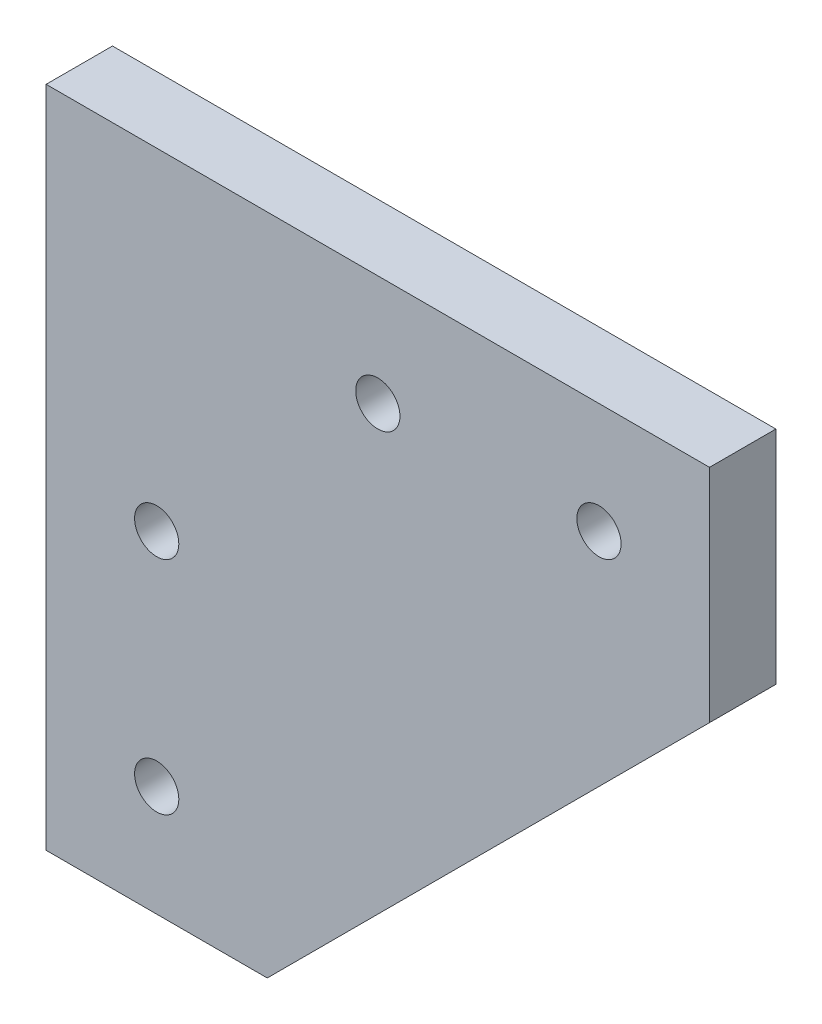
ISO-10303-21;
HEADER;
FILE_DESCRIPTION(('STEP AP214'),'2;1');
FILE_NAME('part.step','',(''),(''),'','','');
FILE_SCHEMA(('AUTOMOTIVE_DESIGN { 1 0 10303 214 1 1 1 1 }'));
ENDSEC;
DATA;
#1=APPLICATION_CONTEXT('core data for automotive mechanical design processes');
#2=APPLICATION_PROTOCOL_DEFINITION('international standard','automotive_design',2000,#1);
#3=PRODUCT_CONTEXT('',#1,'mechanical');
#4=PRODUCT('Part','Part','',(#3));
#5=PRODUCT_RELATED_PRODUCT_CATEGORY('part','',(#4));
#6=PRODUCT_DEFINITION_FORMATION('','',#4);
#7=PRODUCT_DEFINITION_CONTEXT('part definition',#1,'design');
#8=PRODUCT_DEFINITION('design','',#6,#7);
#9=PRODUCT_DEFINITION_SHAPE('','',#8);
#10=(LENGTH_UNIT() NAMED_UNIT(*) SI_UNIT(.MILLI.,.METRE.));
#11=(NAMED_UNIT(*) PLANE_ANGLE_UNIT() SI_UNIT($,.RADIAN.));
#12=(NAMED_UNIT(*) SI_UNIT($,.STERADIAN.) SOLID_ANGLE_UNIT());
#13=UNCERTAINTY_MEASURE_WITH_UNIT(LENGTH_MEASURE(1.E-05),#10,'distance_accuracy_value','');
#14=(GEOMETRIC_REPRESENTATION_CONTEXT(3) GLOBAL_UNCERTAINTY_ASSIGNED_CONTEXT((#13)) GLOBAL_UNIT_ASSIGNED_CONTEXT((#10,
#11,#12)) REPRESENTATION_CONTEXT('',''));
#15=CARTESIAN_POINT('',(0.,0.,0.));
#16=DIRECTION('',(0.,0.,1.));
#17=DIRECTION('',(1.,0.,0.));
#18=AXIS2_PLACEMENT_3D('',#15,#16,#17);
#19=CARTESIAN_POINT('',(0.,0.,6.));
#20=DIRECTION('',(0.,0.,1.));
#21=DIRECTION('',(1.,0.,0.));
#22=AXIS2_PLACEMENT_3D('',#19,#20,#21);
#23=PLANE('',#22);
#24=CARTESIAN_POINT('',(10.,-50.,6.));
#25=DIRECTION('',(0.,0.,1.));
#26=DIRECTION('',(1.,0.,0.));
#27=AXIS2_PLACEMENT_3D('',#24,#25,#26);
#28=CIRCLE('',#27,2.);
#29=CARTESIAN_POINT('',(12.,-50.,6.));
#30=VERTEX_POINT('',#29);
#31=EDGE_CURVE('E172',#30,#30,#28,.T.);
#32=ORIENTED_EDGE('',*,*,#31,.F.);
#33=EDGE_LOOP('',(#32));
#34=FACE_BOUND('',#33,.T.);
#35=CARTESIAN_POINT('',(50.,-10.,6.));
#36=DIRECTION('',(0.,0.,1.));
#37=DIRECTION('',(1.,0.,0.));
#38=AXIS2_PLACEMENT_3D('',#35,#36,#37);
#39=CIRCLE('',#38,2.);
#40=CARTESIAN_POINT('',(52.,-10.,6.));
#41=VERTEX_POINT('',#40);
#42=EDGE_CURVE('E112',#41,#41,#39,.T.);
#43=ORIENTED_EDGE('',*,*,#42,.F.);
#44=EDGE_LOOP('',(#43));
#45=FACE_BOUND('',#44,.T.);
#46=DIRECTION('',(0.,-1.,0.));
#47=VECTOR('',#46,1.);
#48=CARTESIAN_POINT('',(0.,0.,6.));
#49=LINE('',#48,#47);
#50=CARTESIAN_POINT('',(0.,0.,6.));
#51=VERTEX_POINT('',#50);
#52=CARTESIAN_POINT('',(0.,-60.,6.));
#53=VERTEX_POINT('',#52);
#54=EDGE_CURVE('E117',#51,#53,#49,.T.);
#55=ORIENTED_EDGE('',*,*,#54,.T.);
#56=DIRECTION('',(1.,0.,0.));
#57=VECTOR('',#56,1.);
#58=CARTESIAN_POINT('',(0.,-60.,6.));
#59=LINE('',#58,#57);
#60=CARTESIAN_POINT('',(20.,-60.,6.));
#61=VERTEX_POINT('',#60);
#62=EDGE_CURVE('E84',#53,#61,#59,.T.);
#63=ORIENTED_EDGE('',*,*,#62,.T.);
#64=DIRECTION('',(0.707106781186548,0.707106781186548,0.));
#65=VECTOR('',#64,1.);
#66=CARTESIAN_POINT('',(20.,-60.,6.));
#67=LINE('',#66,#65);
#68=CARTESIAN_POINT('',(60.,-20.,6.));
#69=VERTEX_POINT('',#68);
#70=EDGE_CURVE('E88',#61,#69,#67,.T.);
#71=ORIENTED_EDGE('',*,*,#70,.T.);
#72=DIRECTION('',(0.,1.,0.));
#73=VECTOR('',#72,1.);
#74=CARTESIAN_POINT('',(60.,0.,6.));
#75=LINE('',#74,#73);
#76=CARTESIAN_POINT('',(60.,0.,6.));
#77=VERTEX_POINT('',#76);
#78=EDGE_CURVE('E92',#69,#77,#75,.T.);
#79=ORIENTED_EDGE('',*,*,#78,.T.);
#80=DIRECTION('',(-1.,0.,0.));
#81=VECTOR('',#80,1.);
#82=CARTESIAN_POINT('',(0.,0.,6.));
#83=LINE('',#82,#81);
#84=EDGE_CURVE('E50',#77,#51,#83,.T.);
#85=ORIENTED_EDGE('',*,*,#84,.T.);
#86=EDGE_LOOP('',(#55,#63,#71,#79,#85));
#87=FACE_BOUND('',#86,.T.);
#88=CARTESIAN_POINT('',(30.,-10.,6.));
#89=DIRECTION('',(0.,0.,1.));
#90=DIRECTION('',(1.,0.,0.));
#91=AXIS2_PLACEMENT_3D('',#88,#89,#90);
#92=CIRCLE('',#91,2.);
#93=CARTESIAN_POINT('',(32.,-10.,6.));
#94=VERTEX_POINT('',#93);
#95=EDGE_CURVE('E178',#94,#94,#92,.T.);
#96=ORIENTED_EDGE('',*,*,#95,.F.);
#97=EDGE_LOOP('',(#96));
#98=FACE_BOUND('',#97,.T.);
#99=CARTESIAN_POINT('',(10.,-30.,6.));
#100=DIRECTION('',(0.,0.,1.));
#101=DIRECTION('',(1.,0.,0.));
#102=AXIS2_PLACEMENT_3D('',#99,#100,#101);
#103=CIRCLE('',#102,2.);
#104=CARTESIAN_POINT('',(12.,-30.,6.));
#105=VERTEX_POINT('',#104);
#106=EDGE_CURVE('E163',#105,#105,#103,.T.);
#107=ORIENTED_EDGE('',*,*,#106,.F.);
#108=EDGE_LOOP('',(#107));
#109=FACE_BOUND('',#108,.T.);
#110=ADVANCED_FACE('F33',(#34,#45,#87,#98,#109),#23,.T.);
#111=CARTESIAN_POINT('',(0.,0.,0.));
#112=DIRECTION('',(0.,0.,1.));
#113=DIRECTION('',(1.,0.,0.));
#114=AXIS2_PLACEMENT_3D('',#111,#112,#113);
#115=PLANE('',#114);
#116=DIRECTION('',(0.,-1.,0.));
#117=VECTOR('',#116,1.);
#118=CARTESIAN_POINT('',(0.,0.,0.));
#119=LINE('',#118,#117);
#120=CARTESIAN_POINT('',(0.,0.,0.));
#121=VERTEX_POINT('',#120);
#122=CARTESIAN_POINT('',(0.,-60.,0.));
#123=VERTEX_POINT('',#122);
#124=EDGE_CURVE('E108',#121,#123,#119,.T.);
#125=ORIENTED_EDGE('',*,*,#124,.F.);
#126=DIRECTION('',(-1.,0.,0.));
#127=VECTOR('',#126,1.);
#128=CARTESIAN_POINT('',(0.,0.,0.));
#129=LINE('',#128,#127);
#130=CARTESIAN_POINT('',(60.,0.,0.));
#131=VERTEX_POINT('',#130);
#132=EDGE_CURVE('E76',#131,#121,#129,.T.);
#133=ORIENTED_EDGE('',*,*,#132,.F.);
#134=DIRECTION('',(0.,1.,0.));
#135=VECTOR('',#134,1.);
#136=CARTESIAN_POINT('',(60.,0.,0.));
#137=LINE('',#136,#135);
#138=CARTESIAN_POINT('',(60.,-20.,0.));
#139=VERTEX_POINT('',#138);
#140=EDGE_CURVE('E70',#139,#131,#137,.T.);
#141=ORIENTED_EDGE('',*,*,#140,.F.);
#142=DIRECTION('',(0.707106781186548,0.707106781186548,0.));
#143=VECTOR('',#142,1.);
#144=CARTESIAN_POINT('',(20.,-60.,0.));
#145=LINE('',#144,#143);
#146=CARTESIAN_POINT('',(20.,-60.,0.));
#147=VERTEX_POINT('',#146);
#148=EDGE_CURVE('E99',#147,#139,#145,.T.);
#149=ORIENTED_EDGE('',*,*,#148,.F.);
#150=DIRECTION('',(1.,0.,0.));
#151=VECTOR('',#150,1.);
#152=CARTESIAN_POINT('',(0.,-60.,0.));
#153=LINE('',#152,#151);
#154=EDGE_CURVE('E111',#123,#147,#153,.T.);
#155=ORIENTED_EDGE('',*,*,#154,.F.);
#156=EDGE_LOOP('',(#125,#133,#141,#149,#155));
#157=FACE_BOUND('',#156,.T.);
#158=CARTESIAN_POINT('',(50.,-10.,0.));
#159=DIRECTION('',(0.,0.,1.));
#160=DIRECTION('',(1.,0.,0.));
#161=AXIS2_PLACEMENT_3D('',#158,#159,#160);
#162=CIRCLE('',#161,2.);
#163=CARTESIAN_POINT('',(52.,-10.,0.));
#164=VERTEX_POINT('',#163);
#165=EDGE_CURVE('E181',#164,#164,#162,.T.);
#166=ORIENTED_EDGE('',*,*,#165,.T.);
#167=EDGE_LOOP('',(#166));
#168=FACE_BOUND('',#167,.T.);
#169=CARTESIAN_POINT('',(30.,-10.,0.));
#170=DIRECTION('',(0.,0.,1.));
#171=DIRECTION('',(1.,0.,0.));
#172=AXIS2_PLACEMENT_3D('',#169,#170,#171);
#173=CIRCLE('',#172,2.);
#174=CARTESIAN_POINT('',(32.,-10.,0.));
#175=VERTEX_POINT('',#174);
#176=EDGE_CURVE('E175',#175,#175,#173,.T.);
#177=ORIENTED_EDGE('',*,*,#176,.T.);
#178=EDGE_LOOP('',(#177));
#179=FACE_BOUND('',#178,.T.);
#180=CARTESIAN_POINT('',(10.,-50.,0.));
#181=DIRECTION('',(0.,0.,1.));
#182=DIRECTION('',(1.,0.,0.));
#183=AXIS2_PLACEMENT_3D('',#180,#181,#182);
#184=CIRCLE('',#183,2.);
#185=CARTESIAN_POINT('',(12.,-50.,0.));
#186=VERTEX_POINT('',#185);
#187=EDGE_CURVE('E169',#186,#186,#184,.T.);
#188=ORIENTED_EDGE('',*,*,#187,.T.);
#189=EDGE_LOOP('',(#188));
#190=FACE_BOUND('',#189,.T.);
#191=CARTESIAN_POINT('',(10.,-30.,0.));
#192=DIRECTION('',(0.,0.,1.));
#193=DIRECTION('',(1.,0.,0.));
#194=AXIS2_PLACEMENT_3D('',#191,#192,#193);
#195=CIRCLE('',#194,2.);
#196=CARTESIAN_POINT('',(12.,-30.,0.));
#197=VERTEX_POINT('',#196);
#198=EDGE_CURVE('E166',#197,#197,#195,.T.);
#199=ORIENTED_EDGE('',*,*,#198,.T.);
#200=EDGE_LOOP('',(#199));
#201=FACE_BOUND('',#200,.T.);
#202=ADVANCED_FACE('F121',(#157,#168,#179,#190,#201),#115,.F.);
#203=CARTESIAN_POINT('',(0.,0.,6.));
#204=DIRECTION('',(1.,0.,0.));
#205=DIRECTION('',(0.,1.,0.));
#206=AXIS2_PLACEMENT_3D('',#203,#204,#205);
#207=PLANE('',#206);
#208=ORIENTED_EDGE('',*,*,#124,.T.);
#209=DIRECTION('',(0.,0.,-1.));
#210=VECTOR('',#209,1.);
#211=CARTESIAN_POINT('',(0.,-60.,6.));
#212=LINE('',#211,#210);
#213=EDGE_CURVE('E11',#53,#123,#212,.T.);
#214=ORIENTED_EDGE('',*,*,#213,.F.);
#215=ORIENTED_EDGE('',*,*,#54,.F.);
#216=DIRECTION('',(0.,0.,-1.));
#217=VECTOR('',#216,1.);
#218=CARTESIAN_POINT('',(0.,0.,6.));
#219=LINE('',#218,#217);
#220=EDGE_CURVE('E104',#51,#121,#219,.T.);
#221=ORIENTED_EDGE('',*,*,#220,.T.);
#222=EDGE_LOOP('',(#208,#214,#215,#221));
#223=FACE_BOUND('',#222,.T.);
#224=ADVANCED_FACE('F35',(#223),#207,.F.);
#225=CARTESIAN_POINT('',(0.,-60.,6.));
#226=DIRECTION('',(0.,1.,0.));
#227=DIRECTION('',(0.,0.,1.));
#228=AXIS2_PLACEMENT_3D('',#225,#226,#227);
#229=PLANE('',#228);
#230=ORIENTED_EDGE('',*,*,#154,.T.);
#231=DIRECTION('',(0.,0.,-1.));
#232=VECTOR('',#231,1.);
#233=CARTESIAN_POINT('',(20.,-60.,6.));
#234=LINE('',#233,#232);
#235=EDGE_CURVE('E42',#61,#147,#234,.T.);
#236=ORIENTED_EDGE('',*,*,#235,.F.);
#237=ORIENTED_EDGE('',*,*,#62,.F.);
#238=ORIENTED_EDGE('',*,*,#213,.T.);
#239=EDGE_LOOP('',(#230,#236,#237,#238));
#240=FACE_BOUND('',#239,.T.);
#241=ADVANCED_FACE('F230',(#240),#229,.F.);
#242=CARTESIAN_POINT('',(20.,-60.,6.));
#243=DIRECTION('',(-0.707106781186547,0.707106781186547,0.));
#244=DIRECTION('',(-0.707106781186548,-0.707106781186548,0.));
#245=AXIS2_PLACEMENT_3D('',#242,#243,#244);
#246=PLANE('',#245);
#247=ORIENTED_EDGE('',*,*,#148,.T.);
#248=DIRECTION('',(0.,0.,-1.));
#249=VECTOR('',#248,1.);
#250=CARTESIAN_POINT('',(60.,-20.,6.));
#251=LINE('',#250,#249);
#252=EDGE_CURVE('E96',#69,#139,#251,.T.);
#253=ORIENTED_EDGE('',*,*,#252,.F.);
#254=ORIENTED_EDGE('',*,*,#70,.F.);
#255=ORIENTED_EDGE('',*,*,#235,.T.);
#256=EDGE_LOOP('',(#247,#253,#254,#255));
#257=FACE_BOUND('',#256,.T.);
#258=ADVANCED_FACE('F97',(#257),#246,.F.);
#259=CARTESIAN_POINT('',(60.,0.,6.));
#260=DIRECTION('',(-1.,0.,0.));
#261=DIRECTION('',(0.,0.,1.));
#262=AXIS2_PLACEMENT_3D('',#259,#260,#261);
#263=PLANE('',#262);
#264=ORIENTED_EDGE('',*,*,#140,.T.);
#265=DIRECTION('',(0.,0.,-1.));
#266=VECTOR('',#265,1.);
#267=CARTESIAN_POINT('',(60.,0.,6.));
#268=LINE('',#267,#266);
#269=EDGE_CURVE('E100',#77,#131,#268,.T.);
#270=ORIENTED_EDGE('',*,*,#269,.F.);
#271=ORIENTED_EDGE('',*,*,#78,.F.);
#272=ORIENTED_EDGE('',*,*,#252,.T.);
#273=EDGE_LOOP('',(#264,#270,#271,#272));
#274=FACE_BOUND('',#273,.T.);
#275=ADVANCED_FACE('F102',(#274),#263,.F.);
#276=CARTESIAN_POINT('',(0.,0.,6.));
#277=DIRECTION('',(0.,-1.,0.));
#278=DIRECTION('',(0.,0.,-1.));
#279=AXIS2_PLACEMENT_3D('',#276,#277,#278);
#280=PLANE('',#279);
#281=ORIENTED_EDGE('',*,*,#132,.T.);
#282=ORIENTED_EDGE('',*,*,#220,.F.);
#283=ORIENTED_EDGE('',*,*,#84,.F.);
#284=ORIENTED_EDGE('',*,*,#269,.T.);
#285=EDGE_LOOP('',(#281,#282,#283,#284));
#286=FACE_BOUND('',#285,.T.);
#287=ADVANCED_FACE('F126',(#286),#280,.F.);
#288=CARTESIAN_POINT('',(50.,-10.,6.));
#289=DIRECTION('',(0.,0.,-1.));
#290=DIRECTION('',(-1.,0.,0.));
#291=AXIS2_PLACEMENT_3D('',#288,#289,#290);
#292=CYLINDRICAL_SURFACE('',#291,2.);
#293=ORIENTED_EDGE('',*,*,#42,.T.);
#294=EDGE_LOOP('',(#293));
#295=FACE_BOUND('',#294,.T.);
#296=ORIENTED_EDGE('',*,*,#165,.F.);
#297=EDGE_LOOP('',(#296));
#298=FACE_BOUND('',#297,.T.);
#299=ADVANCED_FACE('F128',(#295,#298),#292,.F.);
#300=CARTESIAN_POINT('',(30.,-10.,6.));
#301=DIRECTION('',(0.,0.,-1.));
#302=DIRECTION('',(-1.,0.,0.));
#303=AXIS2_PLACEMENT_3D('',#300,#301,#302);
#304=CYLINDRICAL_SURFACE('',#303,2.);
#305=ORIENTED_EDGE('',*,*,#95,.T.);
#306=EDGE_LOOP('',(#305));
#307=FACE_BOUND('',#306,.T.);
#308=ORIENTED_EDGE('',*,*,#176,.F.);
#309=EDGE_LOOP('',(#308));
#310=FACE_BOUND('',#309,.T.);
#311=ADVANCED_FACE('F134',(#307,#310),#304,.F.);
#312=CARTESIAN_POINT('',(10.,-50.,6.));
#313=DIRECTION('',(0.,0.,-1.));
#314=DIRECTION('',(-1.,0.,0.));
#315=AXIS2_PLACEMENT_3D('',#312,#313,#314);
#316=CYLINDRICAL_SURFACE('',#315,2.);
#317=ORIENTED_EDGE('',*,*,#31,.T.);
#318=EDGE_LOOP('',(#317));
#319=FACE_BOUND('',#318,.T.);
#320=ORIENTED_EDGE('',*,*,#187,.F.);
#321=EDGE_LOOP('',(#320));
#322=FACE_BOUND('',#321,.T.);
#323=ADVANCED_FACE('F150',(#319,#322),#316,.F.);
#324=CARTESIAN_POINT('',(10.,-30.,6.));
#325=DIRECTION('',(0.,0.,-1.));
#326=DIRECTION('',(-1.,0.,0.));
#327=AXIS2_PLACEMENT_3D('',#324,#325,#326);
#328=CYLINDRICAL_SURFACE('',#327,2.);
#329=ORIENTED_EDGE('',*,*,#106,.T.);
#330=EDGE_LOOP('',(#329));
#331=FACE_BOUND('',#330,.T.);
#332=ORIENTED_EDGE('',*,*,#198,.F.);
#333=EDGE_LOOP('',(#332));
#334=FACE_BOUND('',#333,.T.);
#335=ADVANCED_FACE('F154',(#331,#334),#328,.F.);
#336=CLOSED_SHELL('',(#110,#202,#224,#241,#258,#275,#287,#299,#311,#323,#335));
#337=MANIFOLD_SOLID_BREP('B2',#336);
#338=ADVANCED_BREP_SHAPE_REPRESENTATION('',(#18,#337),#14);
#339=SHAPE_DEFINITION_REPRESENTATION(#9,#338);
ENDSEC;
END-ISO-10303-21;
